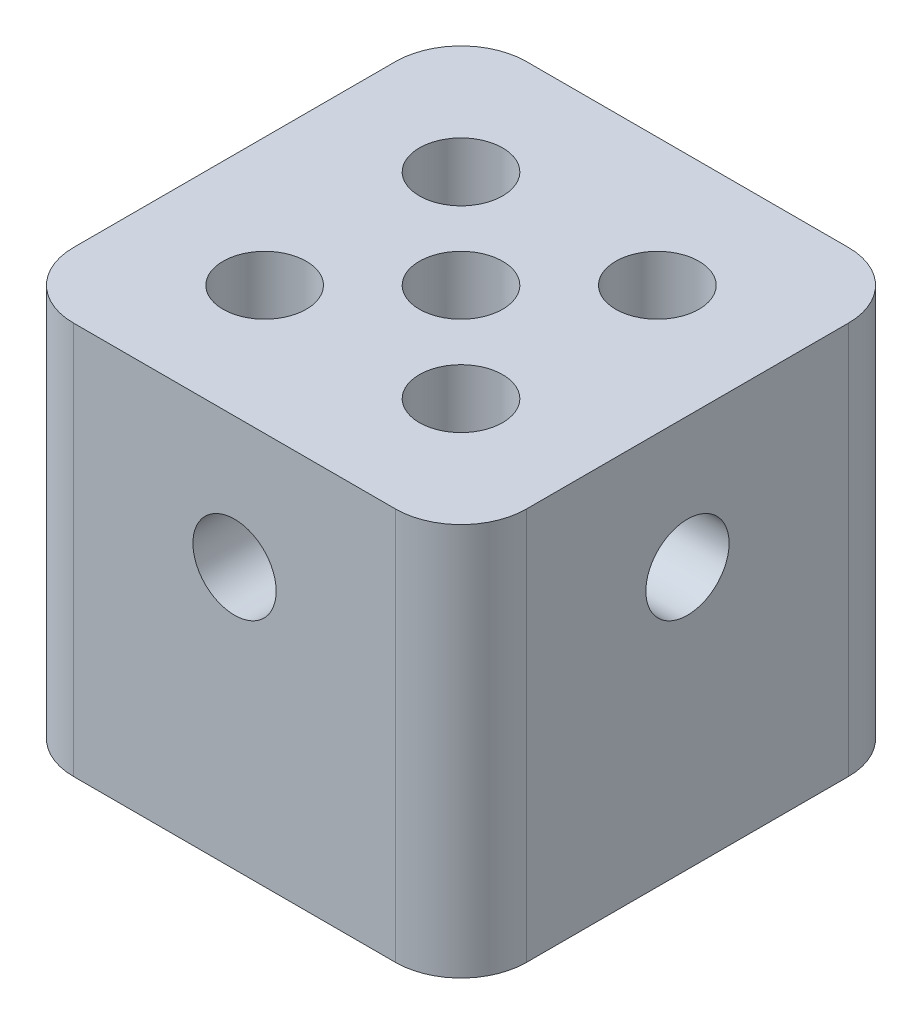
ISO-10303-21;
HEADER;
FILE_DESCRIPTION(('STEP AP214'),'2;1');
FILE_NAME('part.step','',(''),(''),'','','');
FILE_SCHEMA(('AUTOMOTIVE_DESIGN { 1 0 10303 214 1 1 1 1 }'));
ENDSEC;
DATA;
#1=APPLICATION_CONTEXT('core data for automotive mechanical design processes');
#2=APPLICATION_PROTOCOL_DEFINITION('international standard','automotive_design',2000,#1);
#3=PRODUCT_CONTEXT('',#1,'mechanical');
#4=PRODUCT('Part','Part','',(#3));
#5=PRODUCT_RELATED_PRODUCT_CATEGORY('part','',(#4));
#6=PRODUCT_DEFINITION_FORMATION('','',#4);
#7=PRODUCT_DEFINITION_CONTEXT('part definition',#1,'design');
#8=PRODUCT_DEFINITION('design','',#6,#7);
#9=PRODUCT_DEFINITION_SHAPE('','',#8);
#10=(LENGTH_UNIT() NAMED_UNIT(*) SI_UNIT(.MILLI.,.METRE.));
#11=(NAMED_UNIT(*) PLANE_ANGLE_UNIT() SI_UNIT($,.RADIAN.));
#12=(NAMED_UNIT(*) SI_UNIT($,.STERADIAN.) SOLID_ANGLE_UNIT());
#13=UNCERTAINTY_MEASURE_WITH_UNIT(LENGTH_MEASURE(1.E-05),#10,'distance_accuracy_value','');
#14=(GEOMETRIC_REPRESENTATION_CONTEXT(3) GLOBAL_UNCERTAINTY_ASSIGNED_CONTEXT((#13)) GLOBAL_UNIT_ASSIGNED_CONTEXT((#10,
#11,#12)) REPRESENTATION_CONTEXT('',''));
#15=CARTESIAN_POINT('',(0.,0.,0.));
#16=DIRECTION('',(0.,0.,1.));
#17=DIRECTION('',(1.,0.,0.));
#18=AXIS2_PLACEMENT_3D('',#15,#16,#17);
#19=CARTESIAN_POINT('',(0.,19.05,0.));
#20=DIRECTION('',(0.,-1.,0.));
#21=DIRECTION('',(0.,0.,-1.));
#22=AXIS2_PLACEMENT_3D('',#19,#20,#21);
#23=CYLINDRICAL_SURFACE('',#22,2.0193);
#24=CARTESIAN_POINT('',(0.,12.7,0.));
#25=DIRECTION('',(0.707106781186548,-0.707106781186548,0.));
#26=DIRECTION('',(-0.707106781186548,-0.707106781186548,0.));
#27=AXIS2_PLACEMENT_3D('',#24,#25,#26);
#28=ELLIPSE('',#27,2.85572144649999,2.0193);
#29=CARTESIAN_POINT('',(1.42786072324999,14.12786072325,1.42786072325));
#30=VERTEX_POINT('',#29);
#31=CARTESIAN_POINT('',(1.42786072325,14.12786072325,-1.42786072325));
#32=VERTEX_POINT('',#31);
#33=EDGE_CURVE('E109',#30,#32,#28,.F.);
#34=ORIENTED_EDGE('',*,*,#33,.F.);
#35=CARTESIAN_POINT('',(0.,12.7,0.));
#36=DIRECTION('',(0.,-0.707106781186548,0.707106781186548));
#37=DIRECTION('',(0.,-0.707106781186548,-0.707106781186548));
#38=AXIS2_PLACEMENT_3D('',#35,#36,#37);
#39=ELLIPSE('',#38,2.85572144649999,2.0193);
#40=CARTESIAN_POINT('',(-1.42786072325,14.12786072325,1.42786072324999));
#41=VERTEX_POINT('',#40);
#42=EDGE_CURVE('E118',#41,#30,#39,.F.);
#43=ORIENTED_EDGE('',*,*,#42,.F.);
#44=CARTESIAN_POINT('',(0.,12.7,0.));
#45=DIRECTION('',(-0.707106781186548,-0.707106781186548,0.));
#46=DIRECTION('',(0.707106781186548,-0.707106781186548,0.));
#47=AXIS2_PLACEMENT_3D('',#44,#45,#46);
#48=ELLIPSE('',#47,2.85572144649999,2.0193);
#49=CARTESIAN_POINT('',(-1.42786072324999,14.12786072325,-1.42786072325));
#50=VERTEX_POINT('',#49);
#51=EDGE_CURVE('E210',#50,#41,#48,.F.);
#52=ORIENTED_EDGE('',*,*,#51,.F.);
#53=CARTESIAN_POINT('',(0.,12.7,0.));
#54=DIRECTION('',(0.,-0.707106781186548,-0.707106781186548));
#55=DIRECTION('',(0.,-0.707106781186548,0.707106781186548));
#56=AXIS2_PLACEMENT_3D('',#53,#54,#55);
#57=ELLIPSE('',#56,2.85572144649999,2.0193);
#58=EDGE_CURVE('E126',#32,#50,#57,.F.);
#59=ORIENTED_EDGE('',*,*,#58,.F.);
#60=EDGE_LOOP('',(#34,#43,#52,#59));
#61=FACE_BOUND('',#60,.T.);
#62=CARTESIAN_POINT('',(0.,19.05,0.));
#63=DIRECTION('',(0.,1.,0.));
#64=DIRECTION('',(0.,0.,1.));
#65=AXIS2_PLACEMENT_3D('',#62,#63,#64);
#66=CIRCLE('',#65,2.0193);
#67=CARTESIAN_POINT('',(0.,19.05,2.0193));
#68=VERTEX_POINT('',#67);
#69=EDGE_CURVE('E187',#68,#68,#66,.T.);
#70=ORIENTED_EDGE('',*,*,#69,.T.);
#71=EDGE_LOOP('',(#70));
#72=FACE_BOUND('',#71,.T.);
#73=ADVANCED_FACE('F17',(#61,#72),#23,.F.);
#74=CARTESIAN_POINT('',(0.,19.05,0.));
#75=DIRECTION('',(0.,-1.,0.));
#76=DIRECTION('',(0.,0.,-1.));
#77=AXIS2_PLACEMENT_3D('',#74,#75,#76);
#78=PLANE('',#77);
#79=DIRECTION('',(0.,0.,1.));
#80=VECTOR('',#79,1.);
#81=CARTESIAN_POINT('',(-10.9855,19.05,10.9855));
#82=LINE('',#81,#80);
#83=CARTESIAN_POINT('',(-10.9855,19.05,-7.8105));
#84=VERTEX_POINT('',#83);
#85=CARTESIAN_POINT('',(-10.9855,19.05,7.8105));
#86=VERTEX_POINT('',#85);
#87=EDGE_CURVE('E251',#84,#86,#82,.T.);
#88=ORIENTED_EDGE('',*,*,#87,.T.);
#89=CARTESIAN_POINT('',(-7.8105,19.05,7.8105));
#90=DIRECTION('',(0.,-1.,0.));
#91=DIRECTION('',(0.,0.,-1.));
#92=AXIS2_PLACEMENT_3D('',#89,#90,#91);
#93=CIRCLE('',#92,3.175);
#94=CARTESIAN_POINT('',(-7.8105,19.05,10.9855));
#95=VERTEX_POINT('',#94);
#96=EDGE_CURVE('E163',#86,#95,#93,.F.);
#97=ORIENTED_EDGE('',*,*,#96,.T.);
#98=DIRECTION('',(1.,0.,0.));
#99=VECTOR('',#98,1.);
#100=CARTESIAN_POINT('',(-10.9855,19.05,10.9855));
#101=LINE('',#100,#99);
#102=CARTESIAN_POINT('',(7.8105,19.05,10.9855));
#103=VERTEX_POINT('',#102);
#104=EDGE_CURVE('E195',#95,#103,#101,.T.);
#105=ORIENTED_EDGE('',*,*,#104,.T.);
#106=CARTESIAN_POINT('',(7.8105,19.05,7.8105));
#107=DIRECTION('',(0.,-1.,0.));
#108=DIRECTION('',(0.,0.,-1.));
#109=AXIS2_PLACEMENT_3D('',#106,#107,#108);
#110=CIRCLE('',#109,3.175);
#111=CARTESIAN_POINT('',(10.9855,19.05,7.8105));
#112=VERTEX_POINT('',#111);
#113=EDGE_CURVE('E158',#103,#112,#110,.F.);
#114=ORIENTED_EDGE('',*,*,#113,.T.);
#115=DIRECTION('',(0.,0.,-1.));
#116=VECTOR('',#115,1.);
#117=CARTESIAN_POINT('',(10.9855,19.05,10.9855));
#118=LINE('',#117,#116);
#119=CARTESIAN_POINT('',(10.9855,19.05,-7.8105));
#120=VERTEX_POINT('',#119);
#121=EDGE_CURVE('E177',#112,#120,#118,.T.);
#122=ORIENTED_EDGE('',*,*,#121,.T.);
#123=CARTESIAN_POINT('',(7.8105,19.05,-7.8105));
#124=DIRECTION('',(0.,-1.,0.));
#125=DIRECTION('',(0.,0.,-1.));
#126=AXIS2_PLACEMENT_3D('',#123,#124,#125);
#127=CIRCLE('',#126,3.175);
#128=CARTESIAN_POINT('',(7.8105,19.05,-10.9855));
#129=VERTEX_POINT('',#128);
#130=EDGE_CURVE('E39',#120,#129,#127,.F.);
#131=ORIENTED_EDGE('',*,*,#130,.T.);
#132=DIRECTION('',(-1.,0.,0.));
#133=VECTOR('',#132,1.);
#134=CARTESIAN_POINT('',(-10.9855,19.05,-10.9855));
#135=LINE('',#134,#133);
#136=CARTESIAN_POINT('',(-7.8105,19.05,-10.9855));
#137=VERTEX_POINT('',#136);
#138=EDGE_CURVE('E250',#129,#137,#135,.T.);
#139=ORIENTED_EDGE('',*,*,#138,.T.);
#140=CARTESIAN_POINT('',(-7.8105,19.05,-7.8105));
#141=DIRECTION('',(0.,-1.,0.));
#142=DIRECTION('',(0.,0.,-1.));
#143=AXIS2_PLACEMENT_3D('',#140,#141,#142);
#144=CIRCLE('',#143,3.175);
#145=EDGE_CURVE('E161',#137,#84,#144,.F.);
#146=ORIENTED_EDGE('',*,*,#145,.T.);
#147=EDGE_LOOP('',(#88,#97,#105,#114,#122,#131,#139,#146));
#148=FACE_BOUND('',#147,.T.);
#149=ORIENTED_EDGE('',*,*,#69,.F.);
#150=EDGE_LOOP('',(#149));
#151=FACE_BOUND('',#150,.T.);
#152=CARTESIAN_POINT('',(-4.7625,19.05,-4.7625));
#153=DIRECTION('',(0.,1.,0.));
#154=DIRECTION('',(0.,0.,1.));
#155=AXIS2_PLACEMENT_3D('',#152,#153,#154);
#156=CIRCLE('',#155,2.0193);
#157=CARTESIAN_POINT('',(-4.7625,19.05,-2.7432));
#158=VERTEX_POINT('',#157);
#159=EDGE_CURVE('E242',#158,#158,#156,.T.);
#160=ORIENTED_EDGE('',*,*,#159,.F.);
#161=EDGE_LOOP('',(#160));
#162=FACE_BOUND('',#161,.T.);
#163=CARTESIAN_POINT('',(4.7625,19.05,4.7625));
#164=DIRECTION('',(0.,1.,0.));
#165=DIRECTION('',(0.,0.,1.));
#166=AXIS2_PLACEMENT_3D('',#163,#164,#165);
#167=CIRCLE('',#166,2.0193);
#168=CARTESIAN_POINT('',(4.7625,19.05,6.7818));
#169=VERTEX_POINT('',#168);
#170=EDGE_CURVE('E236',#169,#169,#167,.T.);
#171=ORIENTED_EDGE('',*,*,#170,.F.);
#172=EDGE_LOOP('',(#171));
#173=FACE_BOUND('',#172,.T.);
#174=CARTESIAN_POINT('',(4.7625,19.05,-4.7625));
#175=DIRECTION('',(0.,1.,0.));
#176=DIRECTION('',(0.,0.,1.));
#177=AXIS2_PLACEMENT_3D('',#174,#175,#176);
#178=CIRCLE('',#177,2.0193);
#179=CARTESIAN_POINT('',(4.7625,19.05,-2.7432));
#180=VERTEX_POINT('',#179);
#181=EDGE_CURVE('E230',#180,#180,#178,.T.);
#182=ORIENTED_EDGE('',*,*,#181,.F.);
#183=EDGE_LOOP('',(#182));
#184=FACE_BOUND('',#183,.T.);
#185=CARTESIAN_POINT('',(-4.7625,19.05,4.7625));
#186=DIRECTION('',(0.,1.,0.));
#187=DIRECTION('',(0.,0.,1.));
#188=AXIS2_PLACEMENT_3D('',#185,#186,#187);
#189=CIRCLE('',#188,2.0193);
#190=CARTESIAN_POINT('',(-4.7625,19.05,6.7818));
#191=VERTEX_POINT('',#190);
#192=EDGE_CURVE('E224',#191,#191,#189,.T.);
#193=ORIENTED_EDGE('',*,*,#192,.F.);
#194=EDGE_LOOP('',(#193));
#195=FACE_BOUND('',#194,.T.);
#196=ADVANCED_FACE('F257',(#148,#151,#162,#173,#184,#195),#78,.F.);
#197=CARTESIAN_POINT('',(0.,0.,0.));
#198=DIRECTION('',(0.,-1.,0.));
#199=DIRECTION('',(0.,0.,-1.));
#200=AXIS2_PLACEMENT_3D('',#197,#198,#199);
#201=PLANE('',#200);
#202=CARTESIAN_POINT('',(4.7625,0.,-4.7625));
#203=DIRECTION('',(0.,1.,0.));
#204=DIRECTION('',(0.,0.,1.));
#205=AXIS2_PLACEMENT_3D('',#202,#203,#204);
#206=CIRCLE('',#205,2.0193);
#207=CARTESIAN_POINT('',(4.7625,0.,-2.7432));
#208=VERTEX_POINT('',#207);
#209=EDGE_CURVE('E227',#208,#208,#206,.T.);
#210=ORIENTED_EDGE('',*,*,#209,.T.);
#211=EDGE_LOOP('',(#210));
#212=FACE_BOUND('',#211,.T.);
#213=CARTESIAN_POINT('',(-4.7625,0.,-4.7625));
#214=DIRECTION('',(0.,1.,0.));
#215=DIRECTION('',(0.,0.,1.));
#216=AXIS2_PLACEMENT_3D('',#213,#214,#215);
#217=CIRCLE('',#216,2.0193);
#218=CARTESIAN_POINT('',(-4.7625,0.,-2.7432));
#219=VERTEX_POINT('',#218);
#220=EDGE_CURVE('E239',#219,#219,#217,.T.);
#221=ORIENTED_EDGE('',*,*,#220,.T.);
#222=EDGE_LOOP('',(#221));
#223=FACE_BOUND('',#222,.T.);
#224=DIRECTION('',(1.,0.,0.));
#225=VECTOR('',#224,1.);
#226=CARTESIAN_POINT('',(-10.9855,0.,10.9855));
#227=LINE('',#226,#225);
#228=CARTESIAN_POINT('',(-7.8105,0.,10.9855));
#229=VERTEX_POINT('',#228);
#230=CARTESIAN_POINT('',(7.8105,0.,10.9855));
#231=VERTEX_POINT('',#230);
#232=EDGE_CURVE('E200',#229,#231,#227,.T.);
#233=ORIENTED_EDGE('',*,*,#232,.F.);
#234=CARTESIAN_POINT('',(-7.8105,0.,7.8105));
#235=DIRECTION('',(0.,-1.,0.));
#236=DIRECTION('',(0.,0.,-1.));
#237=AXIS2_PLACEMENT_3D('',#234,#235,#236);
#238=CIRCLE('',#237,3.175);
#239=CARTESIAN_POINT('',(-10.9855,0.,7.8105));
#240=VERTEX_POINT('',#239);
#241=EDGE_CURVE('E151',#229,#240,#238,.T.);
#242=ORIENTED_EDGE('',*,*,#241,.T.);
#243=DIRECTION('',(0.,0.,1.));
#244=VECTOR('',#243,1.);
#245=CARTESIAN_POINT('',(-10.9855,0.,10.9855));
#246=LINE('',#245,#244);
#247=CARTESIAN_POINT('',(-10.9855,0.,-7.8105));
#248=VERTEX_POINT('',#247);
#249=EDGE_CURVE('E189',#248,#240,#246,.T.);
#250=ORIENTED_EDGE('',*,*,#249,.F.);
#251=CARTESIAN_POINT('',(-7.8105,0.,-7.8105));
#252=DIRECTION('',(0.,-1.,0.));
#253=DIRECTION('',(0.,0.,-1.));
#254=AXIS2_PLACEMENT_3D('',#251,#252,#253);
#255=CIRCLE('',#254,3.175);
#256=CARTESIAN_POINT('',(-7.8105,0.,-10.9855));
#257=VERTEX_POINT('',#256);
#258=EDGE_CURVE('E149',#248,#257,#255,.T.);
#259=ORIENTED_EDGE('',*,*,#258,.T.);
#260=DIRECTION('',(-1.,0.,0.));
#261=VECTOR('',#260,1.);
#262=CARTESIAN_POINT('',(-10.9855,0.,-10.9855));
#263=LINE('',#262,#261);
#264=CARTESIAN_POINT('',(7.8105,0.,-10.9855));
#265=VERTEX_POINT('',#264);
#266=EDGE_CURVE('E186',#265,#257,#263,.T.);
#267=ORIENTED_EDGE('',*,*,#266,.F.);
#268=CARTESIAN_POINT('',(7.8105,0.,-7.8105));
#269=DIRECTION('',(0.,-1.,0.));
#270=DIRECTION('',(0.,0.,-1.));
#271=AXIS2_PLACEMENT_3D('',#268,#269,#270);
#272=CIRCLE('',#271,3.175);
#273=CARTESIAN_POINT('',(10.9855,0.,-7.8105));
#274=VERTEX_POINT('',#273);
#275=EDGE_CURVE('E147',#265,#274,#272,.T.);
#276=ORIENTED_EDGE('',*,*,#275,.T.);
#277=DIRECTION('',(0.,0.,-1.));
#278=VECTOR('',#277,1.);
#279=CARTESIAN_POINT('',(10.9855,0.,10.9855));
#280=LINE('',#279,#278);
#281=CARTESIAN_POINT('',(10.9855,0.,7.8105));
#282=VERTEX_POINT('',#281);
#283=EDGE_CURVE('E175',#282,#274,#280,.T.);
#284=ORIENTED_EDGE('',*,*,#283,.F.);
#285=CARTESIAN_POINT('',(7.8105,0.,7.8105));
#286=DIRECTION('',(0.,-1.,0.));
#287=DIRECTION('',(0.,0.,-1.));
#288=AXIS2_PLACEMENT_3D('',#285,#286,#287);
#289=CIRCLE('',#288,3.175);
#290=EDGE_CURVE('E145',#282,#231,#289,.T.);
#291=ORIENTED_EDGE('',*,*,#290,.T.);
#292=EDGE_LOOP('',(#233,#242,#250,#259,#267,#276,#284,#291));
#293=FACE_BOUND('',#292,.T.);
#294=CARTESIAN_POINT('',(0.,0.,0.));
#295=DIRECTION('',(0.,1.,0.));
#296=DIRECTION('',(0.,0.,1.));
#297=AXIS2_PLACEMENT_3D('',#294,#295,#296);
#298=CIRCLE('',#297,2.0193);
#299=CARTESIAN_POINT('',(0.,0.,2.0193));
#300=VERTEX_POINT('',#299);
#301=EDGE_CURVE('E192',#300,#300,#298,.T.);
#302=ORIENTED_EDGE('',*,*,#301,.T.);
#303=EDGE_LOOP('',(#302));
#304=FACE_BOUND('',#303,.T.);
#305=CARTESIAN_POINT('',(4.7625,0.,4.7625));
#306=DIRECTION('',(0.,1.,0.));
#307=DIRECTION('',(0.,0.,1.));
#308=AXIS2_PLACEMENT_3D('',#305,#306,#307);
#309=CIRCLE('',#308,2.0193);
#310=CARTESIAN_POINT('',(4.7625,0.,6.7818));
#311=VERTEX_POINT('',#310);
#312=EDGE_CURVE('E233',#311,#311,#309,.T.);
#313=ORIENTED_EDGE('',*,*,#312,.T.);
#314=EDGE_LOOP('',(#313));
#315=FACE_BOUND('',#314,.T.);
#316=CARTESIAN_POINT('',(-4.7625,0.,4.7625));
#317=DIRECTION('',(0.,1.,0.));
#318=DIRECTION('',(0.,0.,1.));
#319=AXIS2_PLACEMENT_3D('',#316,#317,#318);
#320=CIRCLE('',#319,2.0193);
#321=CARTESIAN_POINT('',(-4.7625,0.,6.7818));
#322=VERTEX_POINT('',#321);
#323=EDGE_CURVE('E223',#322,#322,#320,.T.);
#324=ORIENTED_EDGE('',*,*,#323,.T.);
#325=EDGE_LOOP('',(#324));
#326=FACE_BOUND('',#325,.T.);
#327=ADVANCED_FACE('F182',(#212,#223,#293,#304,#315,#326),#201,.T.);
#328=CARTESIAN_POINT('',(10.9855,19.05,10.9855));
#329=DIRECTION('',(-1.,0.,0.));
#330=DIRECTION('',(0.,0.,1.));
#331=AXIS2_PLACEMENT_3D('',#328,#329,#330);
#332=PLANE('',#331);
#333=CARTESIAN_POINT('',(10.9855,12.7,0.));
#334=DIRECTION('',(1.,0.,0.));
#335=DIRECTION('',(0.,0.,-1.));
#336=AXIS2_PLACEMENT_3D('',#333,#334,#335);
#337=CIRCLE('',#336,2.0193);
#338=CARTESIAN_POINT('',(10.9855,12.7,-2.0193));
#339=VERTEX_POINT('',#338);
#340=EDGE_CURVE('E321',#339,#339,#337,.T.);
#341=ORIENTED_EDGE('',*,*,#340,.F.);
#342=EDGE_LOOP('',(#341));
#343=FACE_BOUND('',#342,.T.);
#344=ORIENTED_EDGE('',*,*,#283,.T.);
#345=DIRECTION('',(0.,-1.,0.));
#346=VECTOR('',#345,1.);
#347=CARTESIAN_POINT('',(10.9855,19.05,-7.8105));
#348=LINE('',#347,#346);
#349=EDGE_CURVE('E11',#274,#120,#348,.F.);
#350=ORIENTED_EDGE('',*,*,#349,.T.);
#351=ORIENTED_EDGE('',*,*,#121,.F.);
#352=DIRECTION('',(0.,-1.,0.));
#353=VECTOR('',#352,1.);
#354=CARTESIAN_POINT('',(10.9855,19.05,7.8105));
#355=LINE('',#354,#353);
#356=EDGE_CURVE('E25',#112,#282,#355,.T.);
#357=ORIENTED_EDGE('',*,*,#356,.T.);
#358=EDGE_LOOP('',(#344,#350,#351,#357));
#359=FACE_BOUND('',#358,.T.);
#360=ADVANCED_FACE('F174',(#343,#359),#332,.F.);
#361=CARTESIAN_POINT('',(-10.9855,19.05,-10.9855));
#362=DIRECTION('',(0.,0.,1.));
#363=DIRECTION('',(1.,0.,0.));
#364=AXIS2_PLACEMENT_3D('',#361,#362,#363);
#365=PLANE('',#364);
#366=CARTESIAN_POINT('',(0.,12.7,-10.9855));
#367=DIRECTION('',(0.,0.,1.));
#368=DIRECTION('',(1.,0.,0.));
#369=AXIS2_PLACEMENT_3D('',#366,#367,#368);
#370=CIRCLE('',#369,2.0193);
#371=CARTESIAN_POINT('',(2.0193,12.7,-10.9855));
#372=VERTEX_POINT('',#371);
#373=EDGE_CURVE('E220',#372,#372,#370,.T.);
#374=ORIENTED_EDGE('',*,*,#373,.T.);
#375=EDGE_LOOP('',(#374));
#376=FACE_BOUND('',#375,.T.);
#377=ORIENTED_EDGE('',*,*,#266,.T.);
#378=DIRECTION('',(0.,-1.,0.));
#379=VECTOR('',#378,1.);
#380=CARTESIAN_POINT('',(-7.8105,19.05,-10.9855));
#381=LINE('',#380,#379);
#382=EDGE_CURVE('E32',#257,#137,#381,.F.);
#383=ORIENTED_EDGE('',*,*,#382,.T.);
#384=ORIENTED_EDGE('',*,*,#138,.F.);
#385=DIRECTION('',(0.,-1.,0.));
#386=VECTOR('',#385,1.);
#387=CARTESIAN_POINT('',(7.8105,19.05,-10.9855));
#388=LINE('',#387,#386);
#389=EDGE_CURVE('E165',#129,#265,#388,.T.);
#390=ORIENTED_EDGE('',*,*,#389,.T.);
#391=EDGE_LOOP('',(#377,#383,#384,#390));
#392=FACE_BOUND('',#391,.T.);
#393=ADVANCED_FACE('F305',(#376,#392),#365,.F.);
#394=CARTESIAN_POINT('',(-10.9855,19.05,10.9855));
#395=DIRECTION('',(1.,0.,0.));
#396=DIRECTION('',(0.,0.,-1.));
#397=AXIS2_PLACEMENT_3D('',#394,#395,#396);
#398=PLANE('',#397);
#399=CARTESIAN_POINT('',(-10.9855,12.7,0.));
#400=DIRECTION('',(1.,0.,0.));
#401=DIRECTION('',(0.,0.,-1.));
#402=AXIS2_PLACEMENT_3D('',#399,#400,#401);
#403=CIRCLE('',#402,2.0193);
#404=CARTESIAN_POINT('',(-10.9855,12.7,-2.0193));
#405=VERTEX_POINT('',#404);
#406=EDGE_CURVE('E323',#405,#405,#403,.T.);
#407=ORIENTED_EDGE('',*,*,#406,.T.);
#408=EDGE_LOOP('',(#407));
#409=FACE_BOUND('',#408,.T.);
#410=ORIENTED_EDGE('',*,*,#249,.T.);
#411=DIRECTION('',(0.,-1.,0.));
#412=VECTOR('',#411,1.);
#413=CARTESIAN_POINT('',(-10.9855,19.05,7.8105));
#414=LINE('',#413,#412);
#415=EDGE_CURVE('E156',#240,#86,#414,.F.);
#416=ORIENTED_EDGE('',*,*,#415,.T.);
#417=ORIENTED_EDGE('',*,*,#87,.F.);
#418=DIRECTION('',(0.,-1.,0.));
#419=VECTOR('',#418,1.);
#420=CARTESIAN_POINT('',(-10.9855,19.05,-7.8105));
#421=LINE('',#420,#419);
#422=EDGE_CURVE('E153',#84,#248,#421,.T.);
#423=ORIENTED_EDGE('',*,*,#422,.T.);
#424=EDGE_LOOP('',(#410,#416,#417,#423));
#425=FACE_BOUND('',#424,.T.);
#426=ADVANCED_FACE('F267',(#409,#425),#398,.F.);
#427=CARTESIAN_POINT('',(-10.9855,19.05,10.9855));
#428=DIRECTION('',(0.,0.,-1.));
#429=DIRECTION('',(-1.,0.,0.));
#430=AXIS2_PLACEMENT_3D('',#427,#428,#429);
#431=PLANE('',#430);
#432=CARTESIAN_POINT('',(0.,12.7,10.9855));
#433=DIRECTION('',(0.,0.,1.));
#434=DIRECTION('',(1.,0.,0.));
#435=AXIS2_PLACEMENT_3D('',#432,#433,#434);
#436=CIRCLE('',#435,2.0193);
#437=CARTESIAN_POINT('',(2.0193,12.7,10.9855));
#438=VERTEX_POINT('',#437);
#439=EDGE_CURVE('E217',#438,#438,#436,.T.);
#440=ORIENTED_EDGE('',*,*,#439,.F.);
#441=EDGE_LOOP('',(#440));
#442=FACE_BOUND('',#441,.T.);
#443=ORIENTED_EDGE('',*,*,#104,.F.);
#444=DIRECTION('',(0.,-1.,0.));
#445=VECTOR('',#444,1.);
#446=CARTESIAN_POINT('',(-7.8105,19.05,10.9855));
#447=LINE('',#446,#445);
#448=EDGE_CURVE('E142',#95,#229,#447,.T.);
#449=ORIENTED_EDGE('',*,*,#448,.T.);
#450=ORIENTED_EDGE('',*,*,#232,.T.);
#451=DIRECTION('',(0.,-1.,0.));
#452=VECTOR('',#451,1.);
#453=CARTESIAN_POINT('',(7.8105,19.05,10.9855));
#454=LINE('',#453,#452);
#455=EDGE_CURVE('E140',#231,#103,#454,.F.);
#456=ORIENTED_EDGE('',*,*,#455,.T.);
#457=EDGE_LOOP('',(#443,#449,#450,#456));
#458=FACE_BOUND('',#457,.T.);
#459=ADVANCED_FACE('F262',(#442,#458),#431,.F.);
#460=CARTESIAN_POINT('',(0.,12.7,0.));
#461=DIRECTION('',(0.707106781186548,-0.707106781186548,0.));
#462=DIRECTION('',(-0.707106781186548,-0.707106781186548,0.));
#463=AXIS2_PLACEMENT_3D('',#460,#461,#462);
#464=ELLIPSE('',#463,2.85572144649999,2.0193);
#465=CARTESIAN_POINT('',(-1.42786072325,11.27213927675,1.42786072324999));
#466=VERTEX_POINT('',#465);
#467=CARTESIAN_POINT('',(-1.42786072324999,11.27213927675,-1.42786072325));
#468=VERTEX_POINT('',#467);
#469=EDGE_CURVE('E207',#466,#468,#464,.T.);
#470=ORIENTED_EDGE('',*,*,#469,.F.);
#471=CARTESIAN_POINT('',(0.,12.7,0.));
#472=DIRECTION('',(0.,-0.707106781186548,-0.707106781186548));
#473=DIRECTION('',(0.,-0.707106781186548,0.707106781186548));
#474=AXIS2_PLACEMENT_3D('',#471,#472,#473);
#475=ELLIPSE('',#474,2.85572144649999,2.0193);
#476=CARTESIAN_POINT('',(1.42786072324999,11.27213927675,1.42786072325));
#477=VERTEX_POINT('',#476);
#478=EDGE_CURVE('E135',#477,#466,#475,.T.);
#479=ORIENTED_EDGE('',*,*,#478,.F.);
#480=CARTESIAN_POINT('',(0.,12.7,0.));
#481=DIRECTION('',(-0.707106781186548,-0.707106781186548,0.));
#482=DIRECTION('',(0.707106781186548,-0.707106781186548,0.));
#483=AXIS2_PLACEMENT_3D('',#480,#481,#482);
#484=ELLIPSE('',#483,2.85572144649999,2.0193);
#485=CARTESIAN_POINT('',(1.42786072325,11.27213927675,-1.42786072325));
#486=VERTEX_POINT('',#485);
#487=EDGE_CURVE('E112',#486,#477,#484,.T.);
#488=ORIENTED_EDGE('',*,*,#487,.F.);
#489=CARTESIAN_POINT('',(0.,12.7,0.));
#490=DIRECTION('',(0.,-0.707106781186548,0.707106781186548));
#491=DIRECTION('',(0.,-0.707106781186548,-0.707106781186548));
#492=AXIS2_PLACEMENT_3D('',#489,#490,#491);
#493=ELLIPSE('',#492,2.85572144649999,2.0193);
#494=EDGE_CURVE('E132',#468,#486,#493,.T.);
#495=ORIENTED_EDGE('',*,*,#494,.F.);
#496=EDGE_LOOP('',(#470,#479,#488,#495));
#497=FACE_BOUND('',#496,.T.);
#498=ORIENTED_EDGE('',*,*,#301,.F.);
#499=EDGE_LOOP('',(#498));
#500=FACE_BOUND('',#499,.T.);
#501=ADVANCED_FACE('F204',(#497,#500),#23,.F.);
#502=CARTESIAN_POINT('',(-4.7625,19.05,-4.7625));
#503=DIRECTION('',(0.,-1.,0.));
#504=DIRECTION('',(0.,0.,-1.));
#505=AXIS2_PLACEMENT_3D('',#502,#503,#504);
#506=CYLINDRICAL_SURFACE('',#505,2.0193);
#507=ORIENTED_EDGE('',*,*,#159,.T.);
#508=EDGE_LOOP('',(#507));
#509=FACE_BOUND('',#508,.T.);
#510=ORIENTED_EDGE('',*,*,#220,.F.);
#511=EDGE_LOOP('',(#510));
#512=FACE_BOUND('',#511,.T.);
#513=ADVANCED_FACE('F293',(#509,#512),#506,.F.);
#514=CARTESIAN_POINT('',(4.7625,19.05,4.7625));
#515=DIRECTION('',(0.,-1.,0.));
#516=DIRECTION('',(0.,0.,-1.));
#517=AXIS2_PLACEMENT_3D('',#514,#515,#516);
#518=CYLINDRICAL_SURFACE('',#517,2.0193);
#519=ORIENTED_EDGE('',*,*,#170,.T.);
#520=EDGE_LOOP('',(#519));
#521=FACE_BOUND('',#520,.T.);
#522=ORIENTED_EDGE('',*,*,#312,.F.);
#523=EDGE_LOOP('',(#522));
#524=FACE_BOUND('',#523,.T.);
#525=ADVANCED_FACE('F298',(#521,#524),#518,.F.);
#526=CARTESIAN_POINT('',(4.7625,19.05,-4.7625));
#527=DIRECTION('',(0.,-1.,0.));
#528=DIRECTION('',(0.,0.,-1.));
#529=AXIS2_PLACEMENT_3D('',#526,#527,#528);
#530=CYLINDRICAL_SURFACE('',#529,2.0193);
#531=ORIENTED_EDGE('',*,*,#181,.T.);
#532=EDGE_LOOP('',(#531));
#533=FACE_BOUND('',#532,.T.);
#534=ORIENTED_EDGE('',*,*,#209,.F.);
#535=EDGE_LOOP('',(#534));
#536=FACE_BOUND('',#535,.T.);
#537=ADVANCED_FACE('F402',(#533,#536),#530,.F.);
#538=CARTESIAN_POINT('',(-4.7625,19.05,4.7625));
#539=DIRECTION('',(0.,-1.,0.));
#540=DIRECTION('',(0.,0.,-1.));
#541=AXIS2_PLACEMENT_3D('',#538,#539,#540);
#542=CYLINDRICAL_SURFACE('',#541,2.0193);
#543=ORIENTED_EDGE('',*,*,#192,.T.);
#544=EDGE_LOOP('',(#543));
#545=FACE_BOUND('',#544,.T.);
#546=ORIENTED_EDGE('',*,*,#323,.F.);
#547=EDGE_LOOP('',(#546));
#548=FACE_BOUND('',#547,.T.);
#549=ADVANCED_FACE('F333',(#545,#548),#542,.F.);
#550=CARTESIAN_POINT('',(0.,12.7,-10.9855));
#551=DIRECTION('',(0.,0.,1.));
#552=DIRECTION('',(1.,0.,0.));
#553=AXIS2_PLACEMENT_3D('',#550,#551,#552);
#554=CYLINDRICAL_SURFACE('',#553,2.0193);
#555=ORIENTED_EDGE('',*,*,#494,.T.);
#556=CARTESIAN_POINT('',(0.,12.7,0.));
#557=DIRECTION('',(0.707106781186548,0.,0.707106781186548));
#558=DIRECTION('',(-0.707106781186548,0.,0.707106781186548));
#559=AXIS2_PLACEMENT_3D('',#556,#557,#558);
#560=ELLIPSE('',#559,2.85572144649999,2.0193);
#561=EDGE_CURVE('E127',#486,#32,#560,.T.);
#562=ORIENTED_EDGE('',*,*,#561,.T.);
#563=ORIENTED_EDGE('',*,*,#58,.T.);
#564=CARTESIAN_POINT('',(0.,12.7,0.));
#565=DIRECTION('',(-0.707106781186548,0.,0.707106781186548));
#566=DIRECTION('',(0.707106781186548,0.,0.707106781186548));
#567=AXIS2_PLACEMENT_3D('',#564,#565,#566);
#568=ELLIPSE('',#567,2.85572144649999,2.0193);
#569=EDGE_CURVE('E212',#50,#468,#568,.T.);
#570=ORIENTED_EDGE('',*,*,#569,.T.);
#571=EDGE_LOOP('',(#555,#562,#563,#570));
#572=FACE_BOUND('',#571,.T.);
#573=ORIENTED_EDGE('',*,*,#373,.F.);
#574=EDGE_LOOP('',(#573));
#575=FACE_BOUND('',#574,.T.);
#576=ADVANCED_FACE('F330',(#572,#575),#554,.F.);
#577=ORIENTED_EDGE('',*,*,#478,.T.);
#578=CARTESIAN_POINT('',(0.,12.7,0.));
#579=DIRECTION('',(0.707106781186548,0.,0.707106781186548));
#580=DIRECTION('',(-0.707106781186548,0.,0.707106781186548));
#581=AXIS2_PLACEMENT_3D('',#578,#579,#580);
#582=ELLIPSE('',#581,2.85572144649999,2.0193);
#583=EDGE_CURVE('E117',#466,#41,#582,.F.);
#584=ORIENTED_EDGE('',*,*,#583,.T.);
#585=ORIENTED_EDGE('',*,*,#42,.T.);
#586=CARTESIAN_POINT('',(0.,12.7,0.));
#587=DIRECTION('',(-0.707106781186548,0.,0.707106781186548));
#588=DIRECTION('',(0.707106781186548,0.,0.707106781186548));
#589=AXIS2_PLACEMENT_3D('',#586,#587,#588);
#590=ELLIPSE('',#589,2.85572144649999,2.0193);
#591=EDGE_CURVE('E106',#30,#477,#590,.F.);
#592=ORIENTED_EDGE('',*,*,#591,.T.);
#593=EDGE_LOOP('',(#577,#584,#585,#592));
#594=FACE_BOUND('',#593,.T.);
#595=ORIENTED_EDGE('',*,*,#439,.T.);
#596=EDGE_LOOP('',(#595));
#597=FACE_BOUND('',#596,.T.);
#598=ADVANCED_FACE('F130',(#594,#597),#554,.F.);
#599=CARTESIAN_POINT('',(-10.9855,12.7,0.));
#600=DIRECTION('',(1.,0.,0.));
#601=DIRECTION('',(0.,0.,-1.));
#602=AXIS2_PLACEMENT_3D('',#599,#600,#601);
#603=CYLINDRICAL_SURFACE('',#602,2.0193);
#604=ORIENTED_EDGE('',*,*,#340,.T.);
#605=EDGE_LOOP('',(#604));
#606=FACE_BOUND('',#605,.T.);
#607=ORIENTED_EDGE('',*,*,#487,.T.);
#608=ORIENTED_EDGE('',*,*,#591,.F.);
#609=ORIENTED_EDGE('',*,*,#33,.T.);
#610=ORIENTED_EDGE('',*,*,#561,.F.);
#611=EDGE_LOOP('',(#607,#608,#609,#610));
#612=FACE_BOUND('',#611,.T.);
#613=ADVANCED_FACE('F108',(#606,#612),#603,.F.);
#614=ORIENTED_EDGE('',*,*,#406,.F.);
#615=EDGE_LOOP('',(#614));
#616=FACE_BOUND('',#615,.T.);
#617=ORIENTED_EDGE('',*,*,#51,.T.);
#618=ORIENTED_EDGE('',*,*,#583,.F.);
#619=ORIENTED_EDGE('',*,*,#469,.T.);
#620=ORIENTED_EDGE('',*,*,#569,.F.);
#621=EDGE_LOOP('',(#617,#618,#619,#620));
#622=FACE_BOUND('',#621,.T.);
#623=ADVANCED_FACE('F272',(#616,#622),#603,.F.);
#624=CARTESIAN_POINT('',(-7.8105,19.05,7.8105));
#625=DIRECTION('',(0.,-1.,0.));
#626=DIRECTION('',(0.,0.,-1.));
#627=AXIS2_PLACEMENT_3D('',#624,#625,#626);
#628=CYLINDRICAL_SURFACE('',#627,3.175);
#629=ORIENTED_EDGE('',*,*,#96,.F.);
#630=ORIENTED_EDGE('',*,*,#415,.F.);
#631=ORIENTED_EDGE('',*,*,#241,.F.);
#632=ORIENTED_EDGE('',*,*,#448,.F.);
#633=EDGE_LOOP('',(#629,#630,#631,#632));
#634=FACE_BOUND('',#633,.T.);
#635=ADVANCED_FACE('F269',(#634),#628,.T.);
#636=CARTESIAN_POINT('',(-7.8105,19.05,-7.8105));
#637=DIRECTION('',(0.,-1.,0.));
#638=DIRECTION('',(0.,0.,-1.));
#639=AXIS2_PLACEMENT_3D('',#636,#637,#638);
#640=CYLINDRICAL_SURFACE('',#639,3.175);
#641=ORIENTED_EDGE('',*,*,#145,.F.);
#642=ORIENTED_EDGE('',*,*,#382,.F.);
#643=ORIENTED_EDGE('',*,*,#258,.F.);
#644=ORIENTED_EDGE('',*,*,#422,.F.);
#645=EDGE_LOOP('',(#641,#642,#643,#644));
#646=FACE_BOUND('',#645,.T.);
#647=ADVANCED_FACE('F271',(#646),#640,.T.);
#648=CARTESIAN_POINT('',(7.8105,19.05,-7.8105));
#649=DIRECTION('',(0.,-1.,0.));
#650=DIRECTION('',(0.,0.,-1.));
#651=AXIS2_PLACEMENT_3D('',#648,#649,#650);
#652=CYLINDRICAL_SURFACE('',#651,3.175);
#653=ORIENTED_EDGE('',*,*,#130,.F.);
#654=ORIENTED_EDGE('',*,*,#349,.F.);
#655=ORIENTED_EDGE('',*,*,#275,.F.);
#656=ORIENTED_EDGE('',*,*,#389,.F.);
#657=EDGE_LOOP('',(#653,#654,#655,#656));
#658=FACE_BOUND('',#657,.T.);
#659=ADVANCED_FACE('F279',(#658),#652,.T.);
#660=CARTESIAN_POINT('',(7.8105,19.05,7.8105));
#661=DIRECTION('',(0.,-1.,0.));
#662=DIRECTION('',(0.,0.,-1.));
#663=AXIS2_PLACEMENT_3D('',#660,#661,#662);
#664=CYLINDRICAL_SURFACE('',#663,3.175);
#665=ORIENTED_EDGE('',*,*,#113,.F.);
#666=ORIENTED_EDGE('',*,*,#455,.F.);
#667=ORIENTED_EDGE('',*,*,#290,.F.);
#668=ORIENTED_EDGE('',*,*,#356,.F.);
#669=EDGE_LOOP('',(#665,#666,#667,#668));
#670=FACE_BOUND('',#669,.T.);
#671=ADVANCED_FACE('F19',(#670),#664,.T.);
#672=CLOSED_SHELL('',(#73,#196,#327,#360,#393,#426,#459,#501,#513,#525,#537,#549,#576,#598,#613,
#623,#635,#647,#659,#671));
#673=MANIFOLD_SOLID_BREP('B1',#672);
#674=ADVANCED_BREP_SHAPE_REPRESENTATION('',(#18,#673),#14);
#675=SHAPE_DEFINITION_REPRESENTATION(#9,#674);
ENDSEC;
END-ISO-10303-21;
